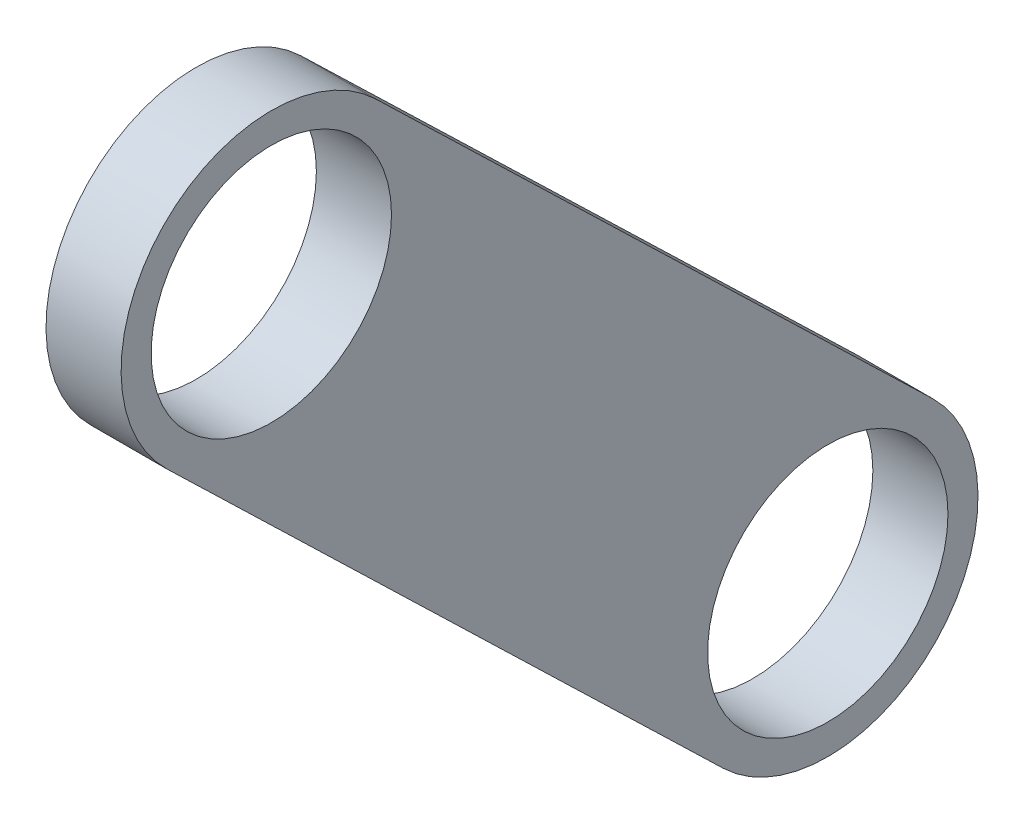
ISO-10303-21;
HEADER;
FILE_DESCRIPTION(('STEP AP214'),'2;1');
FILE_NAME('part.step','',(''),(''),'','','');
FILE_SCHEMA(('AUTOMOTIVE_DESIGN { 1 0 10303 214 1 1 1 1 }'));
ENDSEC;
DATA;
#1=APPLICATION_CONTEXT('core data for automotive mechanical design processes');
#2=APPLICATION_PROTOCOL_DEFINITION('international standard','automotive_design',2000,#1);
#3=PRODUCT_CONTEXT('',#1,'mechanical');
#4=PRODUCT('Part','Part','',(#3));
#5=PRODUCT_RELATED_PRODUCT_CATEGORY('part','',(#4));
#6=PRODUCT_DEFINITION_FORMATION('','',#4);
#7=PRODUCT_DEFINITION_CONTEXT('part definition',#1,'design');
#8=PRODUCT_DEFINITION('design','',#6,#7);
#9=PRODUCT_DEFINITION_SHAPE('','',#8);
#10=(LENGTH_UNIT() NAMED_UNIT(*) SI_UNIT(.MILLI.,.METRE.));
#11=(NAMED_UNIT(*) PLANE_ANGLE_UNIT() SI_UNIT($,.RADIAN.));
#12=(NAMED_UNIT(*) SI_UNIT($,.STERADIAN.) SOLID_ANGLE_UNIT());
#13=UNCERTAINTY_MEASURE_WITH_UNIT(LENGTH_MEASURE(1.E-05),#10,'distance_accuracy_value','');
#14=(GEOMETRIC_REPRESENTATION_CONTEXT(3) GLOBAL_UNCERTAINTY_ASSIGNED_CONTEXT((#13)) GLOBAL_UNIT_ASSIGNED_CONTEXT((#10,
#11,#12)) REPRESENTATION_CONTEXT('',''));
#15=CARTESIAN_POINT('',(0.,0.,0.));
#16=DIRECTION('',(0.,0.,1.));
#17=DIRECTION('',(1.,0.,0.));
#18=AXIS2_PLACEMENT_3D('',#15,#16,#17);
#19=CARTESIAN_POINT('',(-9.00000000000001,-35.7785518512546,-37.0424786890279));
#20=DIRECTION('',(1.,0.,0.));
#21=DIRECTION('',(0.,0.,-1.));
#22=AXIS2_PLACEMENT_3D('',#19,#20,#21);
#23=CYLINDRICAL_SURFACE('',#22,9.99999999999999);
#24=CARTESIAN_POINT('',(-4.,-35.7785518512546,-37.0424786890279));
#25=DIRECTION('',(1.,0.,0.));
#26=DIRECTION('',(0.,0.,-1.));
#27=AXIS2_PLACEMENT_3D('',#24,#25,#26);
#28=CIRCLE('',#27,9.99999999999999);
#29=CARTESIAN_POINT('',(-4.,-42.9712661598037,-30.095187067425));
#30=VERTEX_POINT('',#29);
#31=CARTESIAN_POINT('',(-4.,-28.5858375427055,-43.9897703106307));
#32=VERTEX_POINT('',#31);
#33=EDGE_CURVE('E100',#30,#32,#28,.T.);
#34=ORIENTED_EDGE('',*,*,#33,.F.);
#35=DIRECTION('',(1.,0.,0.));
#36=VECTOR('',#35,1.);
#37=CARTESIAN_POINT('',(-9.00000000000001,-42.9712661598037,-30.095187067425));
#38=LINE('',#37,#36);
#39=CARTESIAN_POINT('',(-9.00000000000001,-42.9712661598037,-30.095187067425));
#40=VERTEX_POINT('',#39);
#41=EDGE_CURVE('E11',#40,#30,#38,.T.);
#42=ORIENTED_EDGE('',*,*,#41,.F.);
#43=CARTESIAN_POINT('',(-9.00000000000001,-35.7785518512546,-37.0424786890279));
#44=DIRECTION('',(1.,0.,0.));
#45=DIRECTION('',(0.,0.,-1.));
#46=AXIS2_PLACEMENT_3D('',#43,#44,#45);
#47=CIRCLE('',#46,9.99999999999999);
#48=CARTESIAN_POINT('',(-9.00000000000001,-28.5858375427055,-43.9897703106307));
#49=VERTEX_POINT('',#48);
#50=EDGE_CURVE('E93',#40,#49,#47,.T.);
#51=ORIENTED_EDGE('',*,*,#50,.T.);
#52=DIRECTION('',(1.,0.,0.));
#53=VECTOR('',#52,1.);
#54=CARTESIAN_POINT('',(-9.00000000000001,-28.5858375427055,-43.9897703106307));
#55=LINE('',#54,#53);
#56=EDGE_CURVE('E38',#49,#32,#55,.T.);
#57=ORIENTED_EDGE('',*,*,#56,.T.);
#58=EDGE_LOOP('',(#34,#42,#51,#57));
#59=FACE_BOUND('',#58,.T.);
#60=ADVANCED_FACE('F35',(#59),#23,.T.);
#61=CARTESIAN_POINT('',(-9.00000000000001,-7.19271430854909,6.94729162160284));
#62=DIRECTION('',(0.,-0.71927143085491,0.694729162160284));
#63=DIRECTION('',(0.,-0.694729162160284,-0.71927143085491));
#64=AXIS2_PLACEMENT_3D('',#61,#62,#63);
#65=PLANE('',#64);
#66=DIRECTION('',(0.,-0.694729162160284,-0.71927143085491));
#67=VECTOR('',#66,1.);
#68=CARTESIAN_POINT('',(-4.,-7.19271430854909,6.94729162160284));
#69=LINE('',#68,#67);
#70=CARTESIAN_POINT('',(-4.,-7.1927143085491,6.94729162160285));
#71=VERTEX_POINT('',#70);
#72=EDGE_CURVE('E95',#71,#30,#69,.T.);
#73=ORIENTED_EDGE('',*,*,#72,.F.);
#74=DIRECTION('',(1.,0.,0.));
#75=VECTOR('',#74,1.);
#76=CARTESIAN_POINT('',(-9.00000000000001,-7.1927143085491,6.94729162160285));
#77=LINE('',#76,#75);
#78=CARTESIAN_POINT('',(-9.00000000000001,-7.1927143085491,6.94729162160285));
#79=VERTEX_POINT('',#78);
#80=EDGE_CURVE('E44',#79,#71,#77,.T.);
#81=ORIENTED_EDGE('',*,*,#80,.F.);
#82=DIRECTION('',(0.,-0.694729162160284,-0.71927143085491));
#83=VECTOR('',#82,1.);
#84=CARTESIAN_POINT('',(-9.00000000000001,-7.19271430854909,6.94729162160284));
#85=LINE('',#84,#83);
#86=EDGE_CURVE('E90',#79,#40,#85,.T.);
#87=ORIENTED_EDGE('',*,*,#86,.T.);
#88=ORIENTED_EDGE('',*,*,#41,.T.);
#89=EDGE_LOOP('',(#73,#81,#87,#88));
#90=FACE_BOUND('',#89,.T.);
#91=ADVANCED_FACE('F111',(#90),#65,.T.);
#92=CARTESIAN_POINT('',(-9.00000000000001,0.,0.));
#93=DIRECTION('',(1.,0.,0.));
#94=DIRECTION('',(0.,0.,-1.));
#95=AXIS2_PLACEMENT_3D('',#92,#93,#94);
#96=CYLINDRICAL_SURFACE('',#95,10.);
#97=CARTESIAN_POINT('',(-4.,0.,0.));
#98=DIRECTION('',(1.,0.,0.));
#99=DIRECTION('',(0.,0.,-1.));
#100=AXIS2_PLACEMENT_3D('',#97,#98,#99);
#101=CIRCLE('',#100,10.);
#102=CARTESIAN_POINT('',(-4.,7.19271430854912,-6.94729162160285));
#103=VERTEX_POINT('',#102);
#104=EDGE_CURVE('E85',#103,#71,#101,.T.);
#105=ORIENTED_EDGE('',*,*,#104,.F.);
#106=DIRECTION('',(1.,0.,0.));
#107=VECTOR('',#106,1.);
#108=CARTESIAN_POINT('',(-9.00000000000001,7.19271430854912,-6.94729162160285));
#109=LINE('',#108,#107);
#110=CARTESIAN_POINT('',(-9.00000000000001,7.19271430854912,-6.94729162160285));
#111=VERTEX_POINT('',#110);
#112=EDGE_CURVE('E80',#111,#103,#109,.T.);
#113=ORIENTED_EDGE('',*,*,#112,.F.);
#114=CARTESIAN_POINT('',(-9.00000000000001,0.,0.));
#115=DIRECTION('',(1.,0.,0.));
#116=DIRECTION('',(0.,0.,-1.));
#117=AXIS2_PLACEMENT_3D('',#114,#115,#116);
#118=CIRCLE('',#117,10.);
#119=EDGE_CURVE('E83',#111,#79,#118,.T.);
#120=ORIENTED_EDGE('',*,*,#119,.T.);
#121=ORIENTED_EDGE('',*,*,#80,.T.);
#122=EDGE_LOOP('',(#105,#113,#120,#121));
#123=FACE_BOUND('',#122,.T.);
#124=ADVANCED_FACE('F82',(#123),#96,.T.);
#125=CARTESIAN_POINT('',(-9.00000000000001,-28.5858375427055,-43.9897703106307));
#126=DIRECTION('',(0.,0.71927143085491,-0.694729162160285));
#127=DIRECTION('',(0.,0.694729162160285,0.71927143085491));
#128=AXIS2_PLACEMENT_3D('',#125,#126,#127);
#129=PLANE('',#128);
#130=DIRECTION('',(0.,0.694729162160284,0.71927143085491));
#131=VECTOR('',#130,1.);
#132=CARTESIAN_POINT('',(-4.,-28.5858375427055,-43.9897703106307));
#133=LINE('',#132,#131);
#134=EDGE_CURVE('E103',#32,#103,#133,.T.);
#135=ORIENTED_EDGE('',*,*,#134,.F.);
#136=ORIENTED_EDGE('',*,*,#56,.F.);
#137=DIRECTION('',(0.,0.694729162160284,0.71927143085491));
#138=VECTOR('',#137,1.);
#139=CARTESIAN_POINT('',(-9.00000000000001,-28.5858375427055,-43.9897703106307));
#140=LINE('',#139,#138);
#141=EDGE_CURVE('E89',#49,#111,#140,.T.);
#142=ORIENTED_EDGE('',*,*,#141,.T.);
#143=ORIENTED_EDGE('',*,*,#112,.T.);
#144=EDGE_LOOP('',(#135,#136,#142,#143));
#145=FACE_BOUND('',#144,.T.);
#146=ADVANCED_FACE('F92',(#145),#129,.T.);
#147=CARTESIAN_POINT('',(-9.00000000000001,-35.7785518512546,-37.0424786890279));
#148=DIRECTION('',(1.,0.,0.));
#149=DIRECTION('',(0.,0.,-1.));
#150=AXIS2_PLACEMENT_3D('',#147,#148,#149);
#151=PLANE('',#150);
#152=CARTESIAN_POINT('',(-9.00000000000001,0.,0.));
#153=DIRECTION('',(1.,0.,0.));
#154=DIRECTION('',(0.,0.,-1.));
#155=AXIS2_PLACEMENT_3D('',#152,#153,#154);
#156=CIRCLE('',#155,8.);
#157=CARTESIAN_POINT('',(-9.00000000000001,0.,-8.));
#158=VERTEX_POINT('',#157);
#159=EDGE_CURVE('E144',#158,#158,#156,.T.);
#160=ORIENTED_EDGE('',*,*,#159,.T.);
#161=EDGE_LOOP('',(#160));
#162=FACE_BOUND('',#161,.T.);
#163=CARTESIAN_POINT('',(-9.00000000000001,-35.7785518512546,-37.0424786890279));
#164=DIRECTION('',(1.,0.,0.));
#165=DIRECTION('',(0.,0.,-1.));
#166=AXIS2_PLACEMENT_3D('',#163,#164,#165);
#167=CIRCLE('',#166,7.99999999999998);
#168=CARTESIAN_POINT('',(-9.00000000000001,-35.7785518512546,-45.0424786890278));
#169=VERTEX_POINT('',#168);
#170=EDGE_CURVE('E104',#169,#169,#167,.T.);
#171=ORIENTED_EDGE('',*,*,#170,.T.);
#172=EDGE_LOOP('',(#171));
#173=FACE_BOUND('',#172,.T.);
#174=ORIENTED_EDGE('',*,*,#50,.F.);
#175=ORIENTED_EDGE('',*,*,#86,.F.);
#176=ORIENTED_EDGE('',*,*,#119,.F.);
#177=ORIENTED_EDGE('',*,*,#141,.F.);
#178=EDGE_LOOP('',(#174,#175,#176,#177));
#179=FACE_BOUND('',#178,.T.);
#180=ADVANCED_FACE('F88',(#162,#173,#179),#151,.F.);
#181=CARTESIAN_POINT('',(-4.,-35.7785518512546,-37.0424786890279));
#182=DIRECTION('',(1.,0.,0.));
#183=DIRECTION('',(0.,0.,-1.));
#184=AXIS2_PLACEMENT_3D('',#181,#182,#183);
#185=PLANE('',#184);
#186=CARTESIAN_POINT('',(-4.,0.,0.));
#187=DIRECTION('',(1.,0.,0.));
#188=DIRECTION('',(0.,0.,-1.));
#189=AXIS2_PLACEMENT_3D('',#186,#187,#188);
#190=CIRCLE('',#189,8.);
#191=CARTESIAN_POINT('',(-4.,0.,-8.));
#192=VERTEX_POINT('',#191);
#193=EDGE_CURVE('E147',#192,#192,#190,.T.);
#194=ORIENTED_EDGE('',*,*,#193,.F.);
#195=EDGE_LOOP('',(#194));
#196=FACE_BOUND('',#195,.T.);
#197=CARTESIAN_POINT('',(-4.,-35.7785518512546,-37.0424786890279));
#198=DIRECTION('',(1.,0.,0.));
#199=DIRECTION('',(0.,0.,-1.));
#200=AXIS2_PLACEMENT_3D('',#197,#198,#199);
#201=CIRCLE('',#200,7.99999999999998);
#202=CARTESIAN_POINT('',(-4.,-35.7785518512546,-45.0424786890278));
#203=VERTEX_POINT('',#202);
#204=EDGE_CURVE('E149',#203,#203,#201,.T.);
#205=ORIENTED_EDGE('',*,*,#204,.F.);
#206=EDGE_LOOP('',(#205));
#207=FACE_BOUND('',#206,.T.);
#208=ORIENTED_EDGE('',*,*,#33,.T.);
#209=ORIENTED_EDGE('',*,*,#134,.T.);
#210=ORIENTED_EDGE('',*,*,#104,.T.);
#211=ORIENTED_EDGE('',*,*,#72,.T.);
#212=EDGE_LOOP('',(#208,#209,#210,#211));
#213=FACE_BOUND('',#212,.T.);
#214=ADVANCED_FACE('F110',(#196,#207,#213),#185,.T.);
#215=CARTESIAN_POINT('',(-9.00000000000001,-35.7785518512546,-37.0424786890279));
#216=DIRECTION('',(1.,0.,0.));
#217=DIRECTION('',(0.,0.,-1.));
#218=AXIS2_PLACEMENT_3D('',#215,#216,#217);
#219=CYLINDRICAL_SURFACE('',#218,7.99999999999998);
#220=ORIENTED_EDGE('',*,*,#170,.F.);
#221=EDGE_LOOP('',(#220));
#222=FACE_BOUND('',#221,.T.);
#223=ORIENTED_EDGE('',*,*,#204,.T.);
#224=EDGE_LOOP('',(#223));
#225=FACE_BOUND('',#224,.T.);
#226=ADVANCED_FACE('F129',(#222,#225),#219,.F.);
#227=CARTESIAN_POINT('',(-9.00000000000001,0.,0.));
#228=DIRECTION('',(1.,0.,0.));
#229=DIRECTION('',(0.,0.,-1.));
#230=AXIS2_PLACEMENT_3D('',#227,#228,#229);
#231=CYLINDRICAL_SURFACE('',#230,8.);
#232=ORIENTED_EDGE('',*,*,#159,.F.);
#233=EDGE_LOOP('',(#232));
#234=FACE_BOUND('',#233,.T.);
#235=ORIENTED_EDGE('',*,*,#193,.T.);
#236=EDGE_LOOP('',(#235));
#237=FACE_BOUND('',#236,.T.);
#238=ADVANCED_FACE('F136',(#234,#237),#231,.F.);
#239=CLOSED_SHELL('',(#60,#91,#124,#146,#180,#214,#226,#238));
#240=MANIFOLD_SOLID_BREP('B2',#239);
#241=ADVANCED_BREP_SHAPE_REPRESENTATION('',(#18,#240),#14);
#242=SHAPE_DEFINITION_REPRESENTATION(#9,#241);
ENDSEC;
END-ISO-10303-21;
